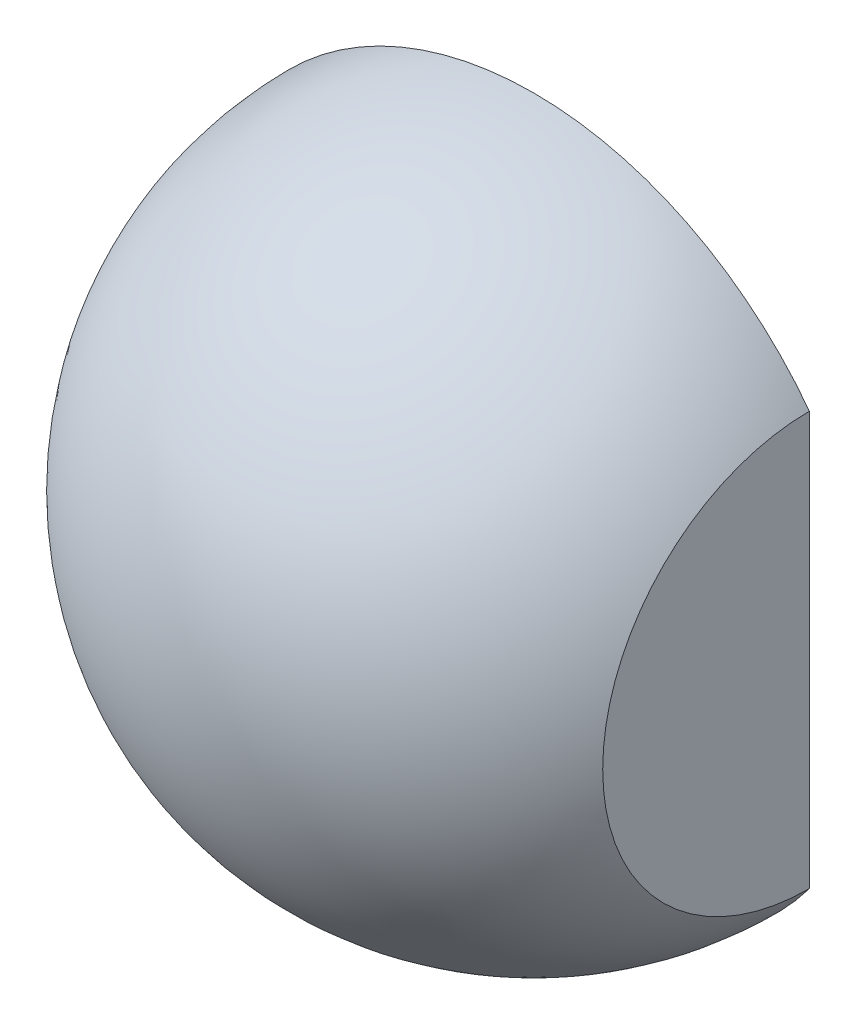
ISO-10303-21;
HEADER;
FILE_DESCRIPTION(('STEP AP214'),'2;1');
FILE_NAME('part.step','',(''),(''),'','','');
FILE_SCHEMA(('AUTOMOTIVE_DESIGN { 1 0 10303 214 1 1 1 1 }'));
ENDSEC;
DATA;
#1=APPLICATION_CONTEXT('core data for automotive mechanical design processes');
#2=APPLICATION_PROTOCOL_DEFINITION('international standard','automotive_design',2000,#1);
#3=PRODUCT_CONTEXT('',#1,'mechanical');
#4=PRODUCT('Part','Part','',(#3));
#5=PRODUCT_RELATED_PRODUCT_CATEGORY('part','',(#4));
#6=PRODUCT_DEFINITION_FORMATION('','',#4);
#7=PRODUCT_DEFINITION_CONTEXT('part definition',#1,'design');
#8=PRODUCT_DEFINITION('design','',#6,#7);
#9=PRODUCT_DEFINITION_SHAPE('','',#8);
#10=(LENGTH_UNIT() NAMED_UNIT(*) SI_UNIT(.MILLI.,.METRE.));
#11=(NAMED_UNIT(*) PLANE_ANGLE_UNIT() SI_UNIT($,.RADIAN.));
#12=(NAMED_UNIT(*) SI_UNIT($,.STERADIAN.) SOLID_ANGLE_UNIT());
#13=UNCERTAINTY_MEASURE_WITH_UNIT(LENGTH_MEASURE(1.E-05),#10,'distance_accuracy_value','');
#14=(GEOMETRIC_REPRESENTATION_CONTEXT(3) GLOBAL_UNCERTAINTY_ASSIGNED_CONTEXT((#13)) GLOBAL_UNIT_ASSIGNED_CONTEXT((#10,
#11,#12)) REPRESENTATION_CONTEXT('',''));
#15=CARTESIAN_POINT('',(0.,0.,0.));
#16=DIRECTION('',(0.,0.,1.));
#17=DIRECTION('',(1.,0.,0.));
#18=AXIS2_PLACEMENT_3D('',#15,#16,#17);
#19=CARTESIAN_POINT('',(0.,15.,0.));
#20=DIRECTION('',(0.,-1.,0.));
#21=DIRECTION('',(1.,0.,0.));
#22=AXIS2_PLACEMENT_3D('',#19,#20,#21);
#23=SPHERICAL_SURFACE('',#22,15.);
#24=CARTESIAN_POINT('',(12.,15.,0.));
#25=DIRECTION('',(1.,0.,0.));
#26=DIRECTION('',(0.,0.,-1.));
#27=AXIS2_PLACEMENT_3D('',#24,#25,#26);
#28=CIRCLE('',#27,8.99999999999999);
#29=CARTESIAN_POINT('',(12.,24.,0.));
#30=VERTEX_POINT('',#29);
#31=CARTESIAN_POINT('',(12.,6.00000000000001,0.));
#32=VERTEX_POINT('',#31);
#33=EDGE_CURVE('E46',#30,#32,#28,.T.);
#34=ORIENTED_EDGE('',*,*,#33,.F.);
#35=CARTESIAN_POINT('',(0.,15.,0.));
#36=DIRECTION('',(0.,0.,-1.));
#37=DIRECTION('',(-1.,0.,0.));
#38=AXIS2_PLACEMENT_3D('',#35,#36,#37);
#39=CIRCLE('',#38,15.);
#40=CARTESIAN_POINT('',(-12.,24.,0.));
#41=VERTEX_POINT('',#40);
#42=EDGE_CURVE('E62',#41,#30,#39,.T.);
#43=ORIENTED_EDGE('',*,*,#42,.F.);
#44=CARTESIAN_POINT('',(-12.,15.,0.));
#45=DIRECTION('',(-1.,0.,0.));
#46=DIRECTION('',(0.,0.,1.));
#47=AXIS2_PLACEMENT_3D('',#44,#45,#46);
#48=CIRCLE('',#47,9.00000000000002);
#49=CARTESIAN_POINT('',(-12.,5.99999999999998,0.));
#50=VERTEX_POINT('',#49);
#51=EDGE_CURVE('E52',#50,#41,#48,.T.);
#52=ORIENTED_EDGE('',*,*,#51,.F.);
#53=EDGE_CURVE('E65',#32,#50,#39,.T.);
#54=ORIENTED_EDGE('',*,*,#53,.F.);
#55=EDGE_LOOP('',(#34,#43,#52,#54));
#56=FACE_BOUND('',#55,.T.);
#57=ADVANCED_FACE('F33',(#56),#23,.T.);
#58=CARTESIAN_POINT('',(0.,15.,0.));
#59=DIRECTION('',(0.,0.,-1.));
#60=DIRECTION('',(-1.,0.,0.));
#61=AXIS2_PLACEMENT_3D('',#58,#59,#60);
#62=PLANE('',#61);
#63=CARTESIAN_POINT('',(0.,15.,0.));
#64=DIRECTION('',(0.,0.,-1.));
#65=DIRECTION('',(-1.,0.,0.));
#66=AXIS2_PLACEMENT_3D('',#63,#64,#65);
#67=CIRCLE('',#66,2.1);
#68=CARTESIAN_POINT('',(-2.1,15.,0.));
#69=VERTEX_POINT('',#68);
#70=EDGE_CURVE('E72',#69,#69,#67,.T.);
#71=ORIENTED_EDGE('',*,*,#70,.F.);
#72=EDGE_LOOP('',(#71));
#73=FACE_BOUND('',#72,.T.);
#74=ORIENTED_EDGE('',*,*,#42,.T.);
#75=DIRECTION('',(0.,-1.,0.));
#76=VECTOR('',#75,1.);
#77=CARTESIAN_POINT('',(12.,15.,0.));
#78=LINE('',#77,#76);
#79=EDGE_CURVE('E11',#30,#32,#78,.T.);
#80=ORIENTED_EDGE('',*,*,#79,.T.);
#81=ORIENTED_EDGE('',*,*,#53,.T.);
#82=DIRECTION('',(0.,1.,0.));
#83=VECTOR('',#82,1.);
#84=CARTESIAN_POINT('',(-12.,15.,0.));
#85=LINE('',#84,#83);
#86=EDGE_CURVE('E40',#50,#41,#85,.T.);
#87=ORIENTED_EDGE('',*,*,#86,.T.);
#88=EDGE_LOOP('',(#74,#80,#81,#87));
#89=FACE_BOUND('',#88,.T.);
#90=ADVANCED_FACE('F68',(#73,#89),#62,.T.);
#91=CARTESIAN_POINT('',(-11.9999999999999,34.7081103483313,10.0000000000001));
#92=DIRECTION('',(-1.,0.,0.));
#93=DIRECTION('',(0.,0.,1.));
#94=AXIS2_PLACEMENT_3D('',#91,#92,#93);
#95=PLANE('',#94);
#96=ORIENTED_EDGE('',*,*,#51,.T.);
#97=ORIENTED_EDGE('',*,*,#86,.F.);
#98=EDGE_LOOP('',(#96,#97));
#99=FACE_BOUND('',#98,.T.);
#100=ADVANCED_FACE('F57',(#99),#95,.T.);
#101=CARTESIAN_POINT('',(12.0000000000001,34.7081103483313,9.99999999999992));
#102=DIRECTION('',(1.,0.,0.));
#103=DIRECTION('',(0.,0.,-1.));
#104=AXIS2_PLACEMENT_3D('',#101,#102,#103);
#105=PLANE('',#104);
#106=ORIENTED_EDGE('',*,*,#33,.T.);
#107=ORIENTED_EDGE('',*,*,#79,.F.);
#108=EDGE_LOOP('',(#106,#107));
#109=FACE_BOUND('',#108,.T.);
#110=ADVANCED_FACE('F83',(#109),#105,.T.);
#111=CARTESIAN_POINT('',(0.,15.,8.));
#112=DIRECTION('',(0.,0.,-1.));
#113=DIRECTION('',(-1.,0.,0.));
#114=AXIS2_PLACEMENT_3D('',#111,#112,#113);
#115=CYLINDRICAL_SURFACE('',#114,2.1);
#116=CARTESIAN_POINT('',(0.,15.,8.));
#117=DIRECTION('',(0.,0.,-1.));
#118=DIRECTION('',(-1.,0.,0.));
#119=AXIS2_PLACEMENT_3D('',#116,#117,#118);
#120=CIRCLE('',#119,2.1);
#121=CARTESIAN_POINT('',(-2.09999999999994,15.,8.00000000000001));
#122=VERTEX_POINT('',#121);
#123=EDGE_CURVE('E66',#122,#122,#120,.T.);
#124=ORIENTED_EDGE('',*,*,#123,.F.);
#125=EDGE_LOOP('',(#124));
#126=FACE_BOUND('',#125,.T.);
#127=ORIENTED_EDGE('',*,*,#70,.T.);
#128=EDGE_LOOP('',(#127));
#129=FACE_BOUND('',#128,.T.);
#130=ADVANCED_FACE('F80',(#126,#129),#115,.F.);
#131=CARTESIAN_POINT('',(0.,15.,8.));
#132=DIRECTION('',(0.,0.,-1.));
#133=DIRECTION('',(-1.,0.,0.));
#134=AXIS2_PLACEMENT_3D('',#131,#132,#133);
#135=PLANE('',#134);
#136=ORIENTED_EDGE('',*,*,#123,.T.);
#137=EDGE_LOOP('',(#136));
#138=FACE_BOUND('',#137,.T.);
#139=ADVANCED_FACE('F78',(#138),#135,.T.);
#140=CLOSED_SHELL('',(#57,#90,#100,#110,#130,#139));
#141=MANIFOLD_SOLID_BREP('B2',#140);
#142=ADVANCED_BREP_SHAPE_REPRESENTATION('',(#18,#141),#14);
#143=SHAPE_DEFINITION_REPRESENTATION(#9,#142);
ENDSEC;
END-ISO-10303-21;
